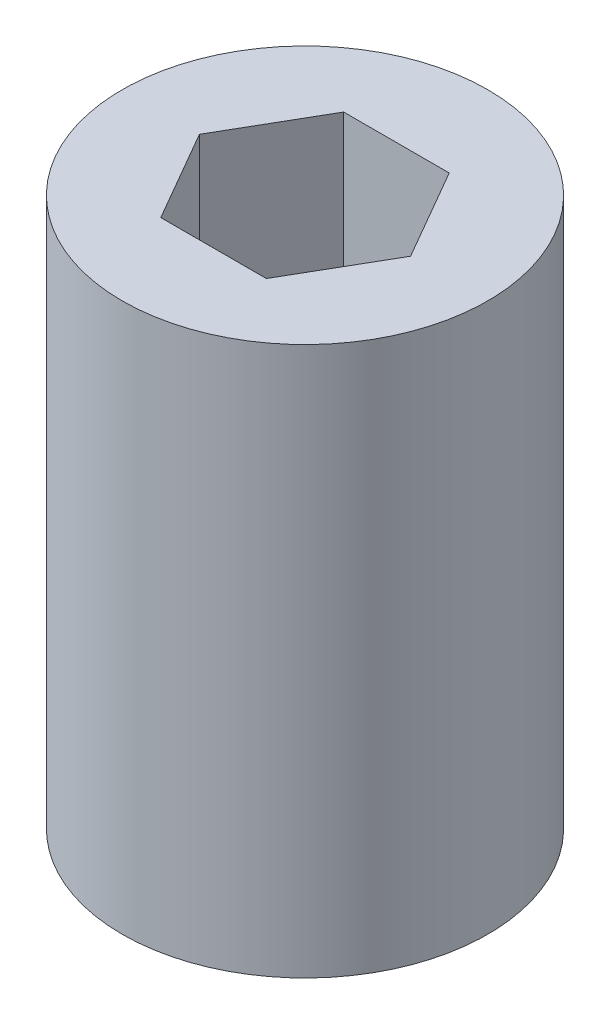
ISO-10303-21;
HEADER;
FILE_DESCRIPTION(('STEP AP214'),'2;1');
FILE_NAME('part.step','',(''),(''),'','','');
FILE_SCHEMA(('AUTOMOTIVE_DESIGN { 1 0 10303 214 1 1 1 1 }'));
ENDSEC;
DATA;
#1=APPLICATION_CONTEXT('core data for automotive mechanical design processes');
#2=APPLICATION_PROTOCOL_DEFINITION('international standard','automotive_design',2000,#1);
#3=PRODUCT_CONTEXT('',#1,'mechanical');
#4=PRODUCT('Part','Part','',(#3));
#5=PRODUCT_RELATED_PRODUCT_CATEGORY('part','',(#4));
#6=PRODUCT_DEFINITION_FORMATION('','',#4);
#7=PRODUCT_DEFINITION_CONTEXT('part definition',#1,'design');
#8=PRODUCT_DEFINITION('design','',#6,#7);
#9=PRODUCT_DEFINITION_SHAPE('','',#8);
#10=(LENGTH_UNIT() NAMED_UNIT(*) SI_UNIT(.MILLI.,.METRE.));
#11=(NAMED_UNIT(*) PLANE_ANGLE_UNIT() SI_UNIT($,.RADIAN.));
#12=(NAMED_UNIT(*) SI_UNIT($,.STERADIAN.) SOLID_ANGLE_UNIT());
#13=UNCERTAINTY_MEASURE_WITH_UNIT(LENGTH_MEASURE(1.E-05),#10,'distance_accuracy_value','');
#14=(GEOMETRIC_REPRESENTATION_CONTEXT(3) GLOBAL_UNCERTAINTY_ASSIGNED_CONTEXT((#13)) GLOBAL_UNIT_ASSIGNED_CONTEXT((#10,
#11,#12)) REPRESENTATION_CONTEXT('',''));
#15=CARTESIAN_POINT('',(0.,0.,0.));
#16=DIRECTION('',(0.,0.,1.));
#17=DIRECTION('',(1.,0.,0.));
#18=AXIS2_PLACEMENT_3D('',#15,#16,#17);
#19=CARTESIAN_POINT('',(0.,38.1,0.));
#20=DIRECTION('',(0.,1.,0.));
#21=DIRECTION('',(0.,0.,1.));
#22=AXIS2_PLACEMENT_3D('',#19,#20,#21);
#23=PLANE('',#22);
#24=CARTESIAN_POINT('',(0.,38.1,0.));
#25=DIRECTION('',(0.,1.,0.));
#26=DIRECTION('',(0.,0.,1.));
#27=AXIS2_PLACEMENT_3D('',#24,#25,#26);
#28=CIRCLE('',#27,12.7);
#29=CARTESIAN_POINT('',(0.,38.1,-12.7));
#30=VERTEX_POINT('',#29);
#31=EDGE_CURVE('E11',#30,#30,#28,.T.);
#32=ORIENTED_EDGE('',*,*,#31,.T.);
#33=EDGE_LOOP('',(#32));
#34=FACE_BOUND('',#33,.T.);
#35=DIRECTION('',(0.5,0.,-0.866025403784439));
#36=VECTOR('',#35,1.);
#37=CARTESIAN_POINT('',(3.66617420935412,38.1,6.35));
#38=LINE('',#37,#36);
#39=CARTESIAN_POINT('',(3.66617420935412,38.1,6.35));
#40=VERTEX_POINT('',#39);
#41=CARTESIAN_POINT('',(7.33234841870825,38.1,0.));
#42=VERTEX_POINT('',#41);
#43=EDGE_CURVE('E98',#40,#42,#38,.T.);
#44=ORIENTED_EDGE('',*,*,#43,.F.);
#45=DIRECTION('',(1.,0.,0.));
#46=VECTOR('',#45,1.);
#47=CARTESIAN_POINT('',(-3.66617420935413,38.1,6.35));
#48=LINE('',#47,#46);
#49=CARTESIAN_POINT('',(-3.66617420935413,38.1,6.35));
#50=VERTEX_POINT('',#49);
#51=EDGE_CURVE('E90',#50,#40,#48,.T.);
#52=ORIENTED_EDGE('',*,*,#51,.F.);
#53=DIRECTION('',(0.5,0.,0.866025403784439));
#54=VECTOR('',#53,1.);
#55=CARTESIAN_POINT('',(-7.33234841870826,38.1,0.));
#56=LINE('',#55,#54);
#57=CARTESIAN_POINT('',(-7.33234841870826,38.1,0.));
#58=VERTEX_POINT('',#57);
#59=EDGE_CURVE('E118',#58,#50,#56,.T.);
#60=ORIENTED_EDGE('',*,*,#59,.F.);
#61=DIRECTION('',(-0.5,0.,0.866025403784439));
#62=VECTOR('',#61,1.);
#63=CARTESIAN_POINT('',(-3.66617420935413,38.1,-6.35));
#64=LINE('',#63,#62);
#65=CARTESIAN_POINT('',(-3.66617420935413,38.1,-6.35));
#66=VERTEX_POINT('',#65);
#67=EDGE_CURVE('E116',#66,#58,#64,.T.);
#68=ORIENTED_EDGE('',*,*,#67,.F.);
#69=DIRECTION('',(-1.,0.,0.));
#70=VECTOR('',#69,1.);
#71=CARTESIAN_POINT('',(3.66617420935412,38.1,-6.35));
#72=LINE('',#71,#70);
#73=CARTESIAN_POINT('',(3.66617420935412,38.1,-6.35));
#74=VERTEX_POINT('',#73);
#75=EDGE_CURVE('E112',#74,#66,#72,.T.);
#76=ORIENTED_EDGE('',*,*,#75,.F.);
#77=DIRECTION('',(-0.5,0.,-0.866025403784438));
#78=VECTOR('',#77,1.);
#79=CARTESIAN_POINT('',(7.33234841870825,38.1,0.));
#80=LINE('',#79,#78);
#81=EDGE_CURVE('E110',#42,#74,#80,.T.);
#82=ORIENTED_EDGE('',*,*,#81,.F.);
#83=EDGE_LOOP('',(#44,#52,#60,#68,#76,#82));
#84=FACE_BOUND('',#83,.T.);
#85=ADVANCED_FACE('F37',(#34,#84),#23,.T.);
#86=CARTESIAN_POINT('',(0.,0.,0.));
#87=DIRECTION('',(0.,1.,0.));
#88=DIRECTION('',(0.,0.,1.));
#89=AXIS2_PLACEMENT_3D('',#86,#87,#88);
#90=PLANE('',#89);
#91=CARTESIAN_POINT('',(0.,0.,0.));
#92=DIRECTION('',(0.,1.,0.));
#93=DIRECTION('',(0.,0.,1.));
#94=AXIS2_PLACEMENT_3D('',#91,#92,#93);
#95=CIRCLE('',#94,12.7);
#96=CARTESIAN_POINT('',(0.,0.,-12.7));
#97=VERTEX_POINT('',#96);
#98=EDGE_CURVE('E41',#97,#97,#95,.T.);
#99=ORIENTED_EDGE('',*,*,#98,.F.);
#100=EDGE_LOOP('',(#99));
#101=FACE_BOUND('',#100,.T.);
#102=DIRECTION('',(1.,0.,0.));
#103=VECTOR('',#102,1.);
#104=CARTESIAN_POINT('',(-3.66617420935413,0.,6.35));
#105=LINE('',#104,#103);
#106=CARTESIAN_POINT('',(-3.66617420935413,0.,6.35));
#107=VERTEX_POINT('',#106);
#108=CARTESIAN_POINT('',(3.66617420935412,0.,6.35));
#109=VERTEX_POINT('',#108);
#110=EDGE_CURVE('E60',#107,#109,#105,.T.);
#111=ORIENTED_EDGE('',*,*,#110,.T.);
#112=DIRECTION('',(0.5,0.,-0.866025403784439));
#113=VECTOR('',#112,1.);
#114=CARTESIAN_POINT('',(3.66617420935412,0.,6.35));
#115=LINE('',#114,#113);
#116=CARTESIAN_POINT('',(7.33234841870825,0.,0.));
#117=VERTEX_POINT('',#116);
#118=EDGE_CURVE('E105',#109,#117,#115,.T.);
#119=ORIENTED_EDGE('',*,*,#118,.T.);
#120=DIRECTION('',(-0.5,0.,-0.866025403784438));
#121=VECTOR('',#120,1.);
#122=CARTESIAN_POINT('',(7.33234841870825,0.,0.));
#123=LINE('',#122,#121);
#124=CARTESIAN_POINT('',(3.66617420935412,0.,-6.35));
#125=VERTEX_POINT('',#124);
#126=EDGE_CURVE('E122',#117,#125,#123,.T.);
#127=ORIENTED_EDGE('',*,*,#126,.T.);
#128=DIRECTION('',(-1.,0.,0.));
#129=VECTOR('',#128,1.);
#130=CARTESIAN_POINT('',(3.66617420935412,0.,-6.35));
#131=LINE('',#130,#129);
#132=CARTESIAN_POINT('',(-3.66617420935413,0.,-6.35));
#133=VERTEX_POINT('',#132);
#134=EDGE_CURVE('E125',#125,#133,#131,.T.);
#135=ORIENTED_EDGE('',*,*,#134,.T.);
#136=DIRECTION('',(-0.5,0.,0.866025403784439));
#137=VECTOR('',#136,1.);
#138=CARTESIAN_POINT('',(-3.66617420935413,0.,-6.35));
#139=LINE('',#138,#137);
#140=CARTESIAN_POINT('',(-7.33234841870826,0.,0.));
#141=VERTEX_POINT('',#140);
#142=EDGE_CURVE('E128',#133,#141,#139,.T.);
#143=ORIENTED_EDGE('',*,*,#142,.T.);
#144=DIRECTION('',(0.5,0.,0.866025403784439));
#145=VECTOR('',#144,1.);
#146=CARTESIAN_POINT('',(-7.33234841870826,0.,0.));
#147=LINE('',#146,#145);
#148=EDGE_CURVE('E99',#141,#107,#147,.T.);
#149=ORIENTED_EDGE('',*,*,#148,.T.);
#150=EDGE_LOOP('',(#111,#119,#127,#135,#143,#149));
#151=FACE_BOUND('',#150,.T.);
#152=ADVANCED_FACE('F145',(#101,#151),#90,.F.);
#153=CARTESIAN_POINT('',(0.,38.1,0.));
#154=DIRECTION('',(0.,-1.,0.));
#155=DIRECTION('',(0.,0.,-1.));
#156=AXIS2_PLACEMENT_3D('',#153,#154,#155);
#157=CYLINDRICAL_SURFACE('',#156,12.7);
#158=CARTESIAN_POINT('',(0.,38.1,-12.7));
#159=CARTESIAN_POINT('',(0.,37.703125,-12.7));
#160=CARTESIAN_POINT('',(0.,37.30625,-12.7));
#161=CARTESIAN_POINT('',(0.,36.5125,-12.7));
#162=CARTESIAN_POINT('',(0.,36.115625,-12.7));
#163=CARTESIAN_POINT('',(0.,35.321875,-12.7));
#164=CARTESIAN_POINT('',(0.,34.925,-12.7));
#165=CARTESIAN_POINT('',(0.,34.13125,-12.7));
#166=CARTESIAN_POINT('',(0.,33.734375,-12.7));
#167=CARTESIAN_POINT('',(0.,32.940625,-12.7));
#168=CARTESIAN_POINT('',(0.,32.54375,-12.7));
#169=CARTESIAN_POINT('',(0.,31.75,-12.7));
#170=CARTESIAN_POINT('',(0.,31.353125,-12.7));
#171=CARTESIAN_POINT('',(0.,30.559375,-12.7));
#172=CARTESIAN_POINT('',(0.,30.1625,-12.7));
#173=CARTESIAN_POINT('',(0.,29.36875,-12.7));
#174=CARTESIAN_POINT('',(0.,28.971875,-12.7));
#175=CARTESIAN_POINT('',(0.,28.178125,-12.7));
#176=CARTESIAN_POINT('',(0.,27.78125,-12.7));
#177=CARTESIAN_POINT('',(0.,26.9875,-12.7));
#178=CARTESIAN_POINT('',(0.,26.590625,-12.7));
#179=CARTESIAN_POINT('',(0.,25.796875,-12.7));
#180=CARTESIAN_POINT('',(0.,25.4,-12.7));
#181=CARTESIAN_POINT('',(0.,24.60625,-12.7));
#182=CARTESIAN_POINT('',(0.,24.209375,-12.7));
#183=CARTESIAN_POINT('',(0.,23.415625,-12.7));
#184=CARTESIAN_POINT('',(0.,23.01875,-12.7));
#185=CARTESIAN_POINT('',(0.,22.225,-12.7));
#186=CARTESIAN_POINT('',(0.,21.828125,-12.7));
#187=CARTESIAN_POINT('',(0.,21.034375,-12.7));
#188=CARTESIAN_POINT('',(0.,20.6375,-12.7));
#189=CARTESIAN_POINT('',(0.,19.84375,-12.7));
#190=CARTESIAN_POINT('',(0.,19.446875,-12.7));
#191=CARTESIAN_POINT('',(0.,18.653125,-12.7));
#192=CARTESIAN_POINT('',(0.,18.25625,-12.7));
#193=CARTESIAN_POINT('',(0.,17.4625,-12.7));
#194=CARTESIAN_POINT('',(0.,17.065625,-12.7));
#195=CARTESIAN_POINT('',(0.,16.271875,-12.7));
#196=CARTESIAN_POINT('',(0.,15.875,-12.7));
#197=CARTESIAN_POINT('',(0.,15.08125,-12.7));
#198=CARTESIAN_POINT('',(0.,14.684375,-12.7));
#199=CARTESIAN_POINT('',(0.,13.890625,-12.7));
#200=CARTESIAN_POINT('',(0.,13.49375,-12.7));
#201=CARTESIAN_POINT('',(0.,12.7,-12.7));
#202=CARTESIAN_POINT('',(0.,12.303125,-12.7));
#203=CARTESIAN_POINT('',(0.,11.509375,-12.7));
#204=CARTESIAN_POINT('',(0.,11.1125,-12.7));
#205=CARTESIAN_POINT('',(0.,10.31875,-12.7));
#206=CARTESIAN_POINT('',(0.,9.92187499999999,-12.7));
#207=CARTESIAN_POINT('',(0.,9.128125,-12.7));
#208=CARTESIAN_POINT('',(0.,8.73124999999999,-12.7));
#209=CARTESIAN_POINT('',(0.,7.93749999999999,-12.7));
#210=CARTESIAN_POINT('',(0.,7.54062499999999,-12.7));
#211=CARTESIAN_POINT('',(0.,6.746875,-12.7));
#212=CARTESIAN_POINT('',(0.,6.35,-12.7));
#213=CARTESIAN_POINT('',(0.,5.55625,-12.7));
#214=CARTESIAN_POINT('',(0.,5.159375,-12.7));
#215=CARTESIAN_POINT('',(0.,4.365625,-12.7));
#216=CARTESIAN_POINT('',(0.,3.96875,-12.7));
#217=CARTESIAN_POINT('',(0.,3.175,-12.7));
#218=CARTESIAN_POINT('',(0.,2.778125,-12.7));
#219=CARTESIAN_POINT('',(0.,1.984375,-12.7));
#220=CARTESIAN_POINT('',(0.,1.5875,-12.7));
#221=CARTESIAN_POINT('',(0.,0.79375,-12.7));
#222=CARTESIAN_POINT('',(0.,0.396875,-12.7));
#223=CARTESIAN_POINT('',(0.,0.,-12.7));
#224=B_SPLINE_CURVE_WITH_KNOTS('',3,(#158,#159,#160,#161,#162,#163,#164,#165,#166,#167,#168,
#169,#170,#171,#172,#173,#174,#175,#176,#177,#178,#179,#180,#181,#182,#183,#184,#185,#186,#187,
#188,#189,#190,#191,#192,#193,#194,#195,#196,#197,#198,#199,#200,#201,#202,#203,#204,#205,#206,
#207,#208,#209,#210,#211,#212,#213,#214,#215,#216,#217,#218,#219,#220,#221,#222,#223),
.UNSPECIFIED.,.F.,.F.,(4,2,2,2,2,2,2,2,2,2,2,2,2,2,2,2,2,2,2,2,2,2,2,2,2,2,2,2,2,2,2,2,4),(0.,
1.190625,2.38125,3.571875,4.7625,5.953125,7.14375,8.334375,9.52500000000001,10.715625,11.90625,
13.096875,14.2875,15.478125,16.66875,17.859375,19.05,20.240625,21.43125,22.621875,23.8125,
25.003125,26.19375,27.384375,28.575,29.765625,30.95625,32.146875,33.3375,34.528125,35.71875,
36.909375,38.1),.UNSPECIFIED.);
#225=EDGE_CURVE('BSEAM39',#30,#97,#224,.T.);
#226=ORIENTED_EDGE('',*,*,#31,.F.);
#227=ORIENTED_EDGE('',*,*,#98,.T.);
#228=ORIENTED_EDGE('',*,*,#225,.T.);
#229=ORIENTED_EDGE('',*,*,#225,.F.);
#230=EDGE_LOOP('',(#226,#228,#227,#229));
#231=FACE_BOUND('',#230,.T.);
#232=ADVANCED_FACE('F39',(#231),#157,.T.);
#233=CARTESIAN_POINT('',(-3.66617420935413,38.1,6.35));
#234=DIRECTION('',(0.,0.,-1.));
#235=DIRECTION('',(-1.,0.,0.));
#236=AXIS2_PLACEMENT_3D('',#233,#234,#235);
#237=PLANE('',#236);
#238=ORIENTED_EDGE('',*,*,#110,.F.);
#239=DIRECTION('',(0.,-1.,0.));
#240=VECTOR('',#239,1.);
#241=CARTESIAN_POINT('',(-3.66617420935413,38.1,6.35));
#242=LINE('',#241,#240);
#243=EDGE_CURVE('E94',#50,#107,#242,.T.);
#244=ORIENTED_EDGE('',*,*,#243,.F.);
#245=ORIENTED_EDGE('',*,*,#51,.T.);
#246=DIRECTION('',(0.,-1.,0.));
#247=VECTOR('',#246,1.);
#248=CARTESIAN_POINT('',(3.66617420935412,38.1,6.35));
#249=LINE('',#248,#247);
#250=EDGE_CURVE('E93',#40,#109,#249,.T.);
#251=ORIENTED_EDGE('',*,*,#250,.T.);
#252=EDGE_LOOP('',(#238,#244,#245,#251));
#253=FACE_BOUND('',#252,.T.);
#254=ADVANCED_FACE('F92',(#253),#237,.T.);
#255=CARTESIAN_POINT('',(3.66617420935412,38.1,6.35));
#256=DIRECTION('',(-0.866025403784439,0.,-0.5));
#257=DIRECTION('',(-0.5,0.,0.866025403784439));
#258=AXIS2_PLACEMENT_3D('',#255,#256,#257);
#259=PLANE('',#258);
#260=ORIENTED_EDGE('',*,*,#118,.F.);
#261=ORIENTED_EDGE('',*,*,#250,.F.);
#262=ORIENTED_EDGE('',*,*,#43,.T.);
#263=DIRECTION('',(0.,-1.,0.));
#264=VECTOR('',#263,1.);
#265=CARTESIAN_POINT('',(7.33234841870825,38.1,0.));
#266=LINE('',#265,#264);
#267=EDGE_CURVE('E106',#42,#117,#266,.T.);
#268=ORIENTED_EDGE('',*,*,#267,.T.);
#269=EDGE_LOOP('',(#260,#261,#262,#268));
#270=FACE_BOUND('',#269,.T.);
#271=ADVANCED_FACE('F102',(#270),#259,.T.);
#272=CARTESIAN_POINT('',(7.33234841870825,38.1,0.));
#273=DIRECTION('',(-0.866025403784438,0.,0.5));
#274=DIRECTION('',(0.5,0.,0.866025403784438));
#275=AXIS2_PLACEMENT_3D('',#272,#273,#274);
#276=PLANE('',#275);
#277=ORIENTED_EDGE('',*,*,#126,.F.);
#278=ORIENTED_EDGE('',*,*,#267,.F.);
#279=ORIENTED_EDGE('',*,*,#81,.T.);
#280=DIRECTION('',(0.,-1.,0.));
#281=VECTOR('',#280,1.);
#282=CARTESIAN_POINT('',(3.66617420935412,38.1,-6.35));
#283=LINE('',#282,#281);
#284=EDGE_CURVE('E137',#74,#125,#283,.T.);
#285=ORIENTED_EDGE('',*,*,#284,.T.);
#286=EDGE_LOOP('',(#277,#278,#279,#285));
#287=FACE_BOUND('',#286,.T.);
#288=ADVANCED_FACE('F141',(#287),#276,.T.);
#289=CARTESIAN_POINT('',(3.66617420935412,38.1,-6.35));
#290=DIRECTION('',(0.,0.,1.));
#291=DIRECTION('',(1.,0.,0.));
#292=AXIS2_PLACEMENT_3D('',#289,#290,#291);
#293=PLANE('',#292);
#294=ORIENTED_EDGE('',*,*,#134,.F.);
#295=ORIENTED_EDGE('',*,*,#284,.F.);
#296=ORIENTED_EDGE('',*,*,#75,.T.);
#297=DIRECTION('',(0.,-1.,0.));
#298=VECTOR('',#297,1.);
#299=CARTESIAN_POINT('',(-3.66617420935413,38.1,-6.35));
#300=LINE('',#299,#298);
#301=EDGE_CURVE('E135',#66,#133,#300,.T.);
#302=ORIENTED_EDGE('',*,*,#301,.T.);
#303=EDGE_LOOP('',(#294,#295,#296,#302));
#304=FACE_BOUND('',#303,.T.);
#305=ADVANCED_FACE('F153',(#304),#293,.T.);
#306=CARTESIAN_POINT('',(-3.66617420935413,38.1,-6.35));
#307=DIRECTION('',(0.866025403784439,0.,0.5));
#308=DIRECTION('',(0.5,0.,-0.866025403784439));
#309=AXIS2_PLACEMENT_3D('',#306,#307,#308);
#310=PLANE('',#309);
#311=ORIENTED_EDGE('',*,*,#142,.F.);
#312=ORIENTED_EDGE('',*,*,#301,.F.);
#313=ORIENTED_EDGE('',*,*,#67,.T.);
#314=DIRECTION('',(0.,-1.,0.));
#315=VECTOR('',#314,1.);
#316=CARTESIAN_POINT('',(-7.33234841870826,38.1,0.));
#317=LINE('',#316,#315);
#318=EDGE_CURVE('E52',#58,#141,#317,.T.);
#319=ORIENTED_EDGE('',*,*,#318,.T.);
#320=EDGE_LOOP('',(#311,#312,#313,#319));
#321=FACE_BOUND('',#320,.T.);
#322=ADVANCED_FACE('F151',(#321),#310,.T.);
#323=CARTESIAN_POINT('',(-7.33234841870826,38.1,0.));
#324=DIRECTION('',(0.866025403784439,0.,-0.5));
#325=DIRECTION('',(-0.5,0.,-0.866025403784438));
#326=AXIS2_PLACEMENT_3D('',#323,#324,#325);
#327=PLANE('',#326);
#328=ORIENTED_EDGE('',*,*,#148,.F.);
#329=ORIENTED_EDGE('',*,*,#318,.F.);
#330=ORIENTED_EDGE('',*,*,#59,.T.);
#331=ORIENTED_EDGE('',*,*,#243,.T.);
#332=EDGE_LOOP('',(#328,#329,#330,#331));
#333=FACE_BOUND('',#332,.T.);
#334=ADVANCED_FACE('F147',(#333),#327,.T.);
#335=CLOSED_SHELL('',(#85,#152,#232,#254,#271,#288,#305,#322,#334));
#336=MANIFOLD_SOLID_BREP('B2',#335);
#337=ADVANCED_BREP_SHAPE_REPRESENTATION('',(#18,#336),#14);
#338=SHAPE_DEFINITION_REPRESENTATION(#9,#337);
ENDSEC;
END-ISO-10303-21;
